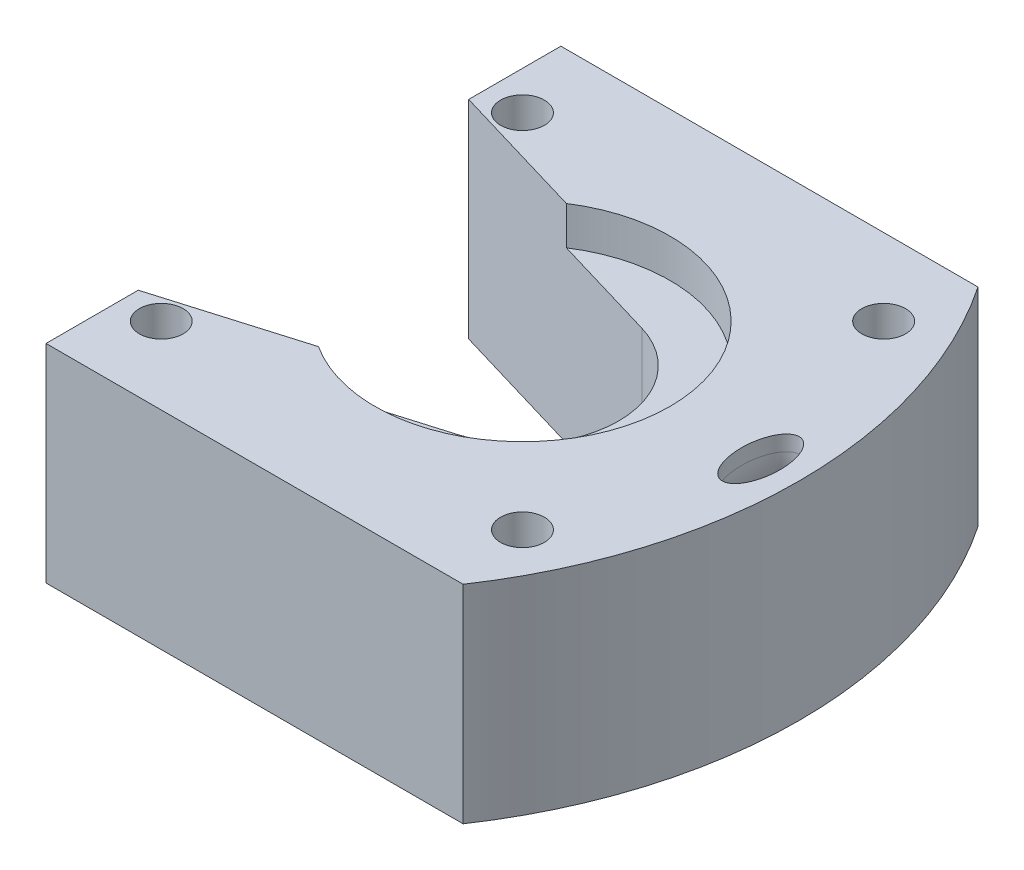
ISO-10303-21;
HEADER;
FILE_DESCRIPTION(('STEP AP214'),'2;1');
FILE_NAME('part.step','',(''),(''),'','','');
FILE_SCHEMA(('AUTOMOTIVE_DESIGN { 1 0 10303 214 1 1 1 1 }'));
ENDSEC;
DATA;
#1=APPLICATION_CONTEXT('core data for automotive mechanical design processes');
#2=APPLICATION_PROTOCOL_DEFINITION('international standard','automotive_design',2000,#1);
#3=PRODUCT_CONTEXT('',#1,'mechanical');
#4=PRODUCT('Part','Part','',(#3));
#5=PRODUCT_RELATED_PRODUCT_CATEGORY('part','',(#4));
#6=PRODUCT_DEFINITION_FORMATION('','',#4);
#7=PRODUCT_DEFINITION_CONTEXT('part definition',#1,'design');
#8=PRODUCT_DEFINITION('design','',#6,#7);
#9=PRODUCT_DEFINITION_SHAPE('','',#8);
#10=(LENGTH_UNIT() NAMED_UNIT(*) SI_UNIT(.MILLI.,.METRE.));
#11=(NAMED_UNIT(*) PLANE_ANGLE_UNIT() SI_UNIT($,.RADIAN.));
#12=(NAMED_UNIT(*) SI_UNIT($,.STERADIAN.) SOLID_ANGLE_UNIT());
#13=UNCERTAINTY_MEASURE_WITH_UNIT(LENGTH_MEASURE(1.E-05),#10,'distance_accuracy_value','');
#14=(GEOMETRIC_REPRESENTATION_CONTEXT(3) GLOBAL_UNCERTAINTY_ASSIGNED_CONTEXT((#13)) GLOBAL_UNIT_ASSIGNED_CONTEXT((#10,
#11,#12)) REPRESENTATION_CONTEXT('',''));
#15=CARTESIAN_POINT('',(0.,0.,0.));
#16=DIRECTION('',(0.,0.,1.));
#17=DIRECTION('',(1.,0.,0.));
#18=AXIS2_PLACEMENT_3D('',#15,#16,#17);
#19=CARTESIAN_POINT('',(184.75,-215.,-12.));
#20=DIRECTION('',(0.,1.,0.));
#21=DIRECTION('',(1.,0.,0.));
#22=AXIS2_PLACEMENT_3D('',#19,#20,#21);
#23=PLANE('',#22);
#24=CARTESIAN_POINT('',(204.5,-215.,11.5));
#25=DIRECTION('',(0.,1.,0.));
#26=DIRECTION('',(1.,0.,0.));
#27=AXIS2_PLACEMENT_3D('',#24,#25,#26);
#28=CIRCLE('',#27,2.85);
#29=CARTESIAN_POINT('',(201.65,-215.,11.5));
#30=VERTEX_POINT('',#29);
#31=EDGE_CURVE('E330',#30,#30,#28,.T.);
#32=ORIENTED_EDGE('',*,*,#31,.T.);
#33=EDGE_LOOP('',(#32));
#34=FACE_BOUND('',#33,.T.);
#35=CARTESIAN_POINT('',(204.5,-215.,-35.5));
#36=DIRECTION('',(0.,1.,0.));
#37=DIRECTION('',(1.,0.,0.));
#38=AXIS2_PLACEMENT_3D('',#35,#36,#37);
#39=CIRCLE('',#38,2.85);
#40=CARTESIAN_POINT('',(201.65,-215.,-35.5));
#41=VERTEX_POINT('',#40);
#42=EDGE_CURVE('E20',#41,#41,#39,.T.);
#43=ORIENTED_EDGE('',*,*,#42,.T.);
#44=EDGE_LOOP('',(#43));
#45=FACE_BOUND('',#44,.T.);
#46=CARTESIAN_POINT('',(157.5,-215.,11.5));
#47=DIRECTION('',(0.,1.,0.));
#48=DIRECTION('',(1.,0.,0.));
#49=AXIS2_PLACEMENT_3D('',#46,#47,#48);
#50=CIRCLE('',#49,2.85);
#51=CARTESIAN_POINT('',(154.65,-215.,11.5));
#52=VERTEX_POINT('',#51);
#53=EDGE_CURVE('E240',#52,#52,#50,.T.);
#54=ORIENTED_EDGE('',*,*,#53,.T.);
#55=EDGE_LOOP('',(#54));
#56=FACE_BOUND('',#55,.T.);
#57=CARTESIAN_POINT('',(157.5,-215.,-35.5));
#58=DIRECTION('',(0.,1.,0.));
#59=DIRECTION('',(1.,0.,0.));
#60=AXIS2_PLACEMENT_3D('',#57,#58,#59);
#61=CIRCLE('',#60,2.85);
#62=CARTESIAN_POINT('',(154.65,-215.,-35.5));
#63=VERTEX_POINT('',#62);
#64=EDGE_CURVE('E282',#63,#63,#61,.T.);
#65=ORIENTED_EDGE('',*,*,#64,.T.);
#66=EDGE_LOOP('',(#65));
#67=FACE_BOUND('',#66,.T.);
#68=CARTESIAN_POINT('',(197.,-215.,-12.));
#69=DIRECTION('',(0.,1.,0.));
#70=DIRECTION('',(0.,0.,-1.));
#71=AXIS2_PLACEMENT_3D('',#68,#69,#70);
#72=ELLIPSE('',#71,5.,2.5);
#73=CARTESIAN_POINT('',(197.,-215.,-7.));
#74=VERTEX_POINT('',#73);
#75=EDGE_CURVE('E221',#74,#74,#72,.T.);
#76=ORIENTED_EDGE('',*,*,#75,.T.);
#77=EDGE_LOOP('',(#76));
#78=FACE_BOUND('',#77,.T.);
#79=DIRECTION('',(0.,0.,-1.));
#80=VECTOR('',#79,1.);
#81=CARTESIAN_POINT('',(152.5,-215.,-22.75));
#82=LINE('',#81,#80);
#83=CARTESIAN_POINT('',(152.5,-215.,-33.5));
#84=VERTEX_POINT('',#83);
#85=CARTESIAN_POINT('',(152.5,-215.,-45.5));
#86=VERTEX_POINT('',#85);
#87=EDGE_CURVE('E351',#84,#86,#82,.T.);
#88=ORIENTED_EDGE('',*,*,#87,.T.);
#89=DIRECTION('',(1.,0.,0.));
#90=VECTOR('',#89,1.);
#91=CARTESIAN_POINT('',(168.625,-215.,-45.5));
#92=LINE('',#91,#90);
#93=CARTESIAN_POINT('',(206.777002722141,-215.,-45.5));
#94=VERTEX_POINT('',#93);
#95=EDGE_CURVE('E98',#86,#94,#92,.T.);
#96=ORIENTED_EDGE('',*,*,#95,.T.);
#97=CARTESIAN_POINT('',(157.,-215.,-12.));
#98=DIRECTION('',(0.,-1.,0.));
#99=DIRECTION('',(0.829616712035677,0.,-0.558333333333334));
#100=AXIS2_PLACEMENT_3D('',#97,#98,#99);
#101=CIRCLE('',#100,60.);
#102=CARTESIAN_POINT('',(206.777002722141,-215.,21.5));
#103=VERTEX_POINT('',#102);
#104=EDGE_CURVE('E212',#94,#103,#101,.T.);
#105=ORIENTED_EDGE('',*,*,#104,.T.);
#106=DIRECTION('',(-1.,0.,0.));
#107=VECTOR('',#106,1.);
#108=CARTESIAN_POINT('',(195.76350136107,-215.,21.5));
#109=LINE('',#108,#107);
#110=CARTESIAN_POINT('',(152.5,-215.,21.5));
#111=VERTEX_POINT('',#110);
#112=EDGE_CURVE('E206',#103,#111,#109,.T.);
#113=ORIENTED_EDGE('',*,*,#112,.T.);
#114=DIRECTION('',(0.,0.,-1.));
#115=VECTOR('',#114,1.);
#116=CARTESIAN_POINT('',(152.5,-215.,4.75));
#117=LINE('',#116,#115);
#118=CARTESIAN_POINT('',(152.5,-215.,9.5));
#119=VERTEX_POINT('',#118);
#120=EDGE_CURVE('E11',#111,#119,#117,.T.);
#121=ORIENTED_EDGE('',*,*,#120,.T.);
#122=DIRECTION('',(0.958648088356799,0.,-0.284594171918287));
#123=VECTOR('',#122,1.);
#124=CARTESIAN_POINT('',(170.251850119446,-215.,4.23000244185445));
#125=LINE('',#124,#123);
#126=CARTESIAN_POINT('',(184.557427148979,-215.,-0.0168988955400634));
#127=VERTEX_POINT('',#126);
#128=EDGE_CURVE('E175',#119,#127,#125,.T.);
#129=ORIENTED_EDGE('',*,*,#128,.T.);
#130=CARTESIAN_POINT('',(181.,-215.,-12.));
#131=DIRECTION('',(0.,1.,0.));
#132=DIRECTION('',(0.284594171918287,0.,-0.958648088356799));
#133=AXIS2_PLACEMENT_3D('',#130,#131,#132);
#134=CIRCLE('',#133,12.5);
#135=CARTESIAN_POINT('',(184.557427148979,-215.,-23.9831011044599));
#136=VERTEX_POINT('',#135);
#137=EDGE_CURVE('E27',#127,#136,#134,.T.);
#138=ORIENTED_EDGE('',*,*,#137,.T.);
#139=DIRECTION('',(-0.958648088356798,0.,-0.284594171918288));
#140=VECTOR('',#139,1.);
#141=CARTESIAN_POINT('',(186.280563693935,-215.,-23.4715529940844));
#142=LINE('',#141,#140);
#143=EDGE_CURVE('E248',#136,#84,#142,.T.);
#144=ORIENTED_EDGE('',*,*,#143,.T.);
#145=EDGE_LOOP('',(#88,#96,#105,#113,#121,#129,#138,#144));
#146=FACE_BOUND('',#145,.T.);
#147=ADVANCED_FACE('F16',(#34,#45,#56,#67,#78,#146),#23,.F.);
#148=CARTESIAN_POINT('',(152.5,-188.,21.5));
#149=DIRECTION('',(-1.,0.,0.));
#150=DIRECTION('',(0.,0.,1.));
#151=AXIS2_PLACEMENT_3D('',#148,#149,#150);
#152=PLANE('',#151);
#153=ORIENTED_EDGE('',*,*,#120,.F.);
#154=DIRECTION('',(0.,-1.,0.));
#155=VECTOR('',#154,1.);
#156=CARTESIAN_POINT('',(152.5,-188.,21.5));
#157=LINE('',#156,#155);
#158=CARTESIAN_POINT('',(152.5,-188.,21.5));
#159=VERTEX_POINT('',#158);
#160=EDGE_CURVE('E216',#159,#111,#157,.T.);
#161=ORIENTED_EDGE('',*,*,#160,.F.);
#162=DIRECTION('',(0.,0.,-1.));
#163=VECTOR('',#162,1.);
#164=CARTESIAN_POINT('',(152.5,-188.,21.5));
#165=LINE('',#164,#163);
#166=CARTESIAN_POINT('',(152.5,-188.,9.5));
#167=VERTEX_POINT('',#166);
#168=EDGE_CURVE('E263',#159,#167,#165,.T.);
#169=ORIENTED_EDGE('',*,*,#168,.T.);
#170=DIRECTION('',(0.,-1.,0.));
#171=VECTOR('',#170,1.);
#172=CARTESIAN_POINT('',(152.5,-188.,9.5));
#173=LINE('',#172,#171);
#174=EDGE_CURVE('E211',#167,#119,#173,.T.);
#175=ORIENTED_EDGE('',*,*,#174,.T.);
#176=EDGE_LOOP('',(#153,#161,#169,#175));
#177=FACE_BOUND('',#176,.T.);
#178=ADVANCED_FACE('F382',(#177),#152,.T.);
#179=CARTESIAN_POINT('',(181.,-188.,-12.));
#180=DIRECTION('',(0.,-1.,0.));
#181=DIRECTION('',(0.284594171918287,0.,-0.958648088356799));
#182=AXIS2_PLACEMENT_3D('',#179,#180,#181);
#183=CYLINDRICAL_SURFACE('',#182,12.5);
#184=CARTESIAN_POINT('',(181.,-193.,-12.));
#185=DIRECTION('',(0.,1.,0.));
#186=DIRECTION('',(0.284594171918287,0.,-0.958648088356799));
#187=AXIS2_PLACEMENT_3D('',#184,#185,#186);
#188=CIRCLE('',#187,12.5);
#189=CARTESIAN_POINT('',(184.557427148979,-193.,-0.0168988955400629));
#190=VERTEX_POINT('',#189);
#191=CARTESIAN_POINT('',(184.557427148979,-193.,-23.9831011044599));
#192=VERTEX_POINT('',#191);
#193=EDGE_CURVE('E169',#190,#192,#188,.T.);
#194=ORIENTED_EDGE('',*,*,#193,.T.);
#195=DIRECTION('',(0.,-1.,0.));
#196=VECTOR('',#195,1.);
#197=CARTESIAN_POINT('',(184.557427148979,-188.,-23.9831011044599));
#198=LINE('',#197,#196);
#199=EDGE_CURVE('E228',#192,#136,#198,.T.);
#200=ORIENTED_EDGE('',*,*,#199,.T.);
#201=ORIENTED_EDGE('',*,*,#137,.F.);
#202=DIRECTION('',(0.,-1.,0.));
#203=VECTOR('',#202,1.);
#204=CARTESIAN_POINT('',(184.557427148979,-188.,-0.0168988955400634));
#205=LINE('',#204,#203);
#206=EDGE_CURVE('E167',#190,#127,#205,.T.);
#207=ORIENTED_EDGE('',*,*,#206,.F.);
#208=EDGE_LOOP('',(#194,#200,#201,#207));
#209=FACE_BOUND('',#208,.T.);
#210=ADVANCED_FACE('F18',(#209),#183,.F.);
#211=CARTESIAN_POINT('',(184.557427148979,-188.,-23.9831011044599));
#212=DIRECTION('',(-0.284594171918288,0.,0.958648088356798));
#213=DIRECTION('',(0.,1.,0.));
#214=AXIS2_PLACEMENT_3D('',#211,#212,#213);
#215=PLANE('',#214);
#216=DIRECTION('',(0.,1.,0.));
#217=VECTOR('',#216,1.);
#218=CARTESIAN_POINT('',(170.586467348339,-188.,-28.1306645155362));
#219=LINE('',#218,#217);
#220=CARTESIAN_POINT('',(170.586467348339,-193.,-28.1306645155362));
#221=VERTEX_POINT('',#220);
#222=CARTESIAN_POINT('',(170.586467348339,-188.,-28.1306645155362));
#223=VERTEX_POINT('',#222);
#224=EDGE_CURVE('E276',#221,#223,#219,.T.);
#225=ORIENTED_EDGE('',*,*,#224,.T.);
#226=DIRECTION('',(-0.958648088356798,0.,-0.284594171918288));
#227=VECTOR('',#226,1.);
#228=CARTESIAN_POINT('',(184.557427148979,-188.,-23.9831011044599));
#229=LINE('',#228,#227);
#230=CARTESIAN_POINT('',(152.5,-188.,-33.5));
#231=VERTEX_POINT('',#230);
#232=EDGE_CURVE('E238',#223,#231,#229,.T.);
#233=ORIENTED_EDGE('',*,*,#232,.T.);
#234=DIRECTION('',(0.,-1.,0.));
#235=VECTOR('',#234,1.);
#236=CARTESIAN_POINT('',(152.5,-188.,-33.5));
#237=LINE('',#236,#235);
#238=EDGE_CURVE('E340',#231,#84,#237,.T.);
#239=ORIENTED_EDGE('',*,*,#238,.T.);
#240=ORIENTED_EDGE('',*,*,#143,.F.);
#241=ORIENTED_EDGE('',*,*,#199,.F.);
#242=DIRECTION('',(-0.958648088356798,0.,-0.284594171918288));
#243=VECTOR('',#242,1.);
#244=CARTESIAN_POINT('',(186.576131547511,-193.,-23.3838076686041));
#245=LINE('',#244,#243);
#246=EDGE_CURVE('E183',#192,#221,#245,.T.);
#247=ORIENTED_EDGE('',*,*,#246,.T.);
#248=EDGE_LOOP('',(#225,#233,#239,#240,#241,#247));
#249=FACE_BOUND('',#248,.T.);
#250=ADVANCED_FACE('F375',(#249),#215,.T.);
#251=CARTESIAN_POINT('',(157.5,-188.,-35.5));
#252=DIRECTION('',(0.,-1.,0.));
#253=DIRECTION('',(1.,0.,0.));
#254=AXIS2_PLACEMENT_3D('',#251,#252,#253);
#255=CYLINDRICAL_SURFACE('',#254,2.85);
#256=ORIENTED_EDGE('',*,*,#64,.F.);
#257=DIRECTION('',(0.,1.,0.));
#258=VECTOR('',#257,1.);
#259=CARTESIAN_POINT('',(154.65,-188.,-35.5));
#260=LINE('',#259,#258);
#261=CARTESIAN_POINT('',(154.65,-188.,-35.5));
#262=VERTEX_POINT('',#261);
#263=EDGE_CURVE('E204',#63,#262,#260,.T.);
#264=ORIENTED_EDGE('',*,*,#263,.T.);
#265=CARTESIAN_POINT('',(157.5,-188.,-35.5));
#266=DIRECTION('',(0.,1.,0.));
#267=DIRECTION('',(1.,0.,0.));
#268=AXIS2_PLACEMENT_3D('',#265,#266,#267);
#269=CIRCLE('',#268,2.85);
#270=EDGE_CURVE('E176',#262,#262,#269,.T.);
#271=ORIENTED_EDGE('',*,*,#270,.T.);
#272=ORIENTED_EDGE('',*,*,#263,.F.);
#273=EDGE_LOOP('',(#256,#264,#271,#272));
#274=FACE_BOUND('',#273,.T.);
#275=ADVANCED_FACE('F436',(#274),#255,.F.);
#276=CARTESIAN_POINT('',(157.5,-188.,11.5));
#277=DIRECTION('',(0.,-1.,0.));
#278=DIRECTION('',(1.,0.,0.));
#279=AXIS2_PLACEMENT_3D('',#276,#277,#278);
#280=CYLINDRICAL_SURFACE('',#279,2.85);
#281=ORIENTED_EDGE('',*,*,#53,.F.);
#282=DIRECTION('',(0.,1.,0.));
#283=VECTOR('',#282,1.);
#284=CARTESIAN_POINT('',(154.65,-188.,11.5));
#285=LINE('',#284,#283);
#286=CARTESIAN_POINT('',(154.65,-188.,11.5));
#287=VERTEX_POINT('',#286);
#288=EDGE_CURVE('E243',#52,#287,#285,.T.);
#289=ORIENTED_EDGE('',*,*,#288,.T.);
#290=CARTESIAN_POINT('',(157.5,-188.,11.5));
#291=DIRECTION('',(0.,1.,0.));
#292=DIRECTION('',(1.,0.,0.));
#293=AXIS2_PLACEMENT_3D('',#290,#291,#292);
#294=CIRCLE('',#293,2.85);
#295=EDGE_CURVE('E267',#287,#287,#294,.T.);
#296=ORIENTED_EDGE('',*,*,#295,.T.);
#297=ORIENTED_EDGE('',*,*,#288,.F.);
#298=EDGE_LOOP('',(#281,#289,#296,#297));
#299=FACE_BOUND('',#298,.T.);
#300=ADVANCED_FACE('F429',(#299),#280,.F.);
#301=CARTESIAN_POINT('',(204.5,-188.,-35.5));
#302=DIRECTION('',(0.,-1.,0.));
#303=DIRECTION('',(1.,0.,0.));
#304=AXIS2_PLACEMENT_3D('',#301,#302,#303);
#305=CYLINDRICAL_SURFACE('',#304,2.85);
#306=ORIENTED_EDGE('',*,*,#42,.F.);
#307=DIRECTION('',(0.,1.,0.));
#308=VECTOR('',#307,1.);
#309=CARTESIAN_POINT('',(201.65,-188.,-35.5));
#310=LINE('',#309,#308);
#311=CARTESIAN_POINT('',(201.65,-188.,-35.5));
#312=VERTEX_POINT('',#311);
#313=EDGE_CURVE('E244',#41,#312,#310,.T.);
#314=ORIENTED_EDGE('',*,*,#313,.T.);
#315=CARTESIAN_POINT('',(204.5,-188.,-35.5));
#316=DIRECTION('',(0.,1.,0.));
#317=DIRECTION('',(1.,0.,0.));
#318=AXIS2_PLACEMENT_3D('',#315,#316,#317);
#319=CIRCLE('',#318,2.85);
#320=EDGE_CURVE('E237',#312,#312,#319,.T.);
#321=ORIENTED_EDGE('',*,*,#320,.T.);
#322=ORIENTED_EDGE('',*,*,#313,.F.);
#323=EDGE_LOOP('',(#306,#314,#321,#322));
#324=FACE_BOUND('',#323,.T.);
#325=ADVANCED_FACE('F425',(#324),#305,.F.);
#326=CARTESIAN_POINT('',(204.5,-188.,11.5));
#327=DIRECTION('',(0.,-1.,0.));
#328=DIRECTION('',(1.,0.,0.));
#329=AXIS2_PLACEMENT_3D('',#326,#327,#328);
#330=CYLINDRICAL_SURFACE('',#329,2.85);
#331=ORIENTED_EDGE('',*,*,#31,.F.);
#332=DIRECTION('',(0.,1.,0.));
#333=VECTOR('',#332,1.);
#334=CARTESIAN_POINT('',(201.65,-188.,11.5));
#335=LINE('',#334,#333);
#336=CARTESIAN_POINT('',(201.65,-188.,11.5));
#337=VERTEX_POINT('',#336);
#338=EDGE_CURVE('E328',#30,#337,#335,.T.);
#339=ORIENTED_EDGE('',*,*,#338,.T.);
#340=CARTESIAN_POINT('',(204.5,-188.,11.5));
#341=DIRECTION('',(0.,1.,0.));
#342=DIRECTION('',(1.,0.,0.));
#343=AXIS2_PLACEMENT_3D('',#340,#341,#342);
#344=CIRCLE('',#343,2.85);
#345=EDGE_CURVE('E234',#337,#337,#344,.T.);
#346=ORIENTED_EDGE('',*,*,#345,.T.);
#347=ORIENTED_EDGE('',*,*,#338,.F.);
#348=EDGE_LOOP('',(#331,#339,#346,#347));
#349=FACE_BOUND('',#348,.T.);
#350=ADVANCED_FACE('F428',(#349),#330,.F.);
#351=CARTESIAN_POINT('',(152.5,-188.,-33.5));
#352=DIRECTION('',(-1.,0.,0.));
#353=DIRECTION('',(0.,0.,1.));
#354=AXIS2_PLACEMENT_3D('',#351,#352,#353);
#355=PLANE('',#354);
#356=ORIENTED_EDGE('',*,*,#87,.F.);
#357=ORIENTED_EDGE('',*,*,#238,.F.);
#358=DIRECTION('',(0.,0.,1.));
#359=VECTOR('',#358,1.);
#360=CARTESIAN_POINT('',(152.5,-188.,-45.5));
#361=LINE('',#360,#359);
#362=CARTESIAN_POINT('',(152.5,-188.,-45.5));
#363=VERTEX_POINT('',#362);
#364=EDGE_CURVE('E257',#363,#231,#361,.T.);
#365=ORIENTED_EDGE('',*,*,#364,.F.);
#366=DIRECTION('',(0.,-1.,0.));
#367=VECTOR('',#366,1.);
#368=CARTESIAN_POINT('',(152.5,-188.,-45.5));
#369=LINE('',#368,#367);
#370=EDGE_CURVE('E225',#363,#86,#369,.T.);
#371=ORIENTED_EDGE('',*,*,#370,.T.);
#372=EDGE_LOOP('',(#356,#357,#365,#371));
#373=FACE_BOUND('',#372,.T.);
#374=ADVANCED_FACE('F372',(#373),#355,.T.);
#375=CARTESIAN_POINT('',(152.5,-188.,-45.5));
#376=DIRECTION('',(0.,0.,-1.));
#377=DIRECTION('',(-1.,0.,0.));
#378=AXIS2_PLACEMENT_3D('',#375,#376,#377);
#379=PLANE('',#378);
#380=ORIENTED_EDGE('',*,*,#95,.F.);
#381=ORIENTED_EDGE('',*,*,#370,.F.);
#382=DIRECTION('',(1.,0.,0.));
#383=VECTOR('',#382,1.);
#384=CARTESIAN_POINT('',(152.5,-188.,-45.5));
#385=LINE('',#384,#383);
#386=CARTESIAN_POINT('',(206.777002722141,-188.,-45.5));
#387=VERTEX_POINT('',#386);
#388=EDGE_CURVE('E318',#363,#387,#385,.T.);
#389=ORIENTED_EDGE('',*,*,#388,.T.);
#390=DIRECTION('',(0.,-1.,0.));
#391=VECTOR('',#390,1.);
#392=CARTESIAN_POINT('',(206.777002722141,-188.,-45.5));
#393=LINE('',#392,#391);
#394=EDGE_CURVE('E215',#387,#94,#393,.T.);
#395=ORIENTED_EDGE('',*,*,#394,.T.);
#396=EDGE_LOOP('',(#380,#381,#389,#395));
#397=FACE_BOUND('',#396,.T.);
#398=ADVANCED_FACE('F440',(#397),#379,.T.);
#399=CARTESIAN_POINT('',(157.,-188.,-12.));
#400=DIRECTION('',(0.,-1.,0.));
#401=DIRECTION('',(0.829616712035677,0.,-0.558333333333334));
#402=AXIS2_PLACEMENT_3D('',#399,#400,#401);
#403=CYLINDRICAL_SURFACE('',#402,60.);
#404=ORIENTED_EDGE('',*,*,#104,.F.);
#405=ORIENTED_EDGE('',*,*,#394,.F.);
#406=CARTESIAN_POINT('',(157.,-188.,-12.));
#407=DIRECTION('',(0.,-1.,0.));
#408=DIRECTION('',(0.829616712035677,0.,-0.558333333333334));
#409=AXIS2_PLACEMENT_3D('',#406,#407,#408);
#410=CIRCLE('',#409,60.);
#411=CARTESIAN_POINT('',(206.777002722141,-188.,21.5));
#412=VERTEX_POINT('',#411);
#413=EDGE_CURVE('E262',#387,#412,#410,.T.);
#414=ORIENTED_EDGE('',*,*,#413,.T.);
#415=DIRECTION('',(0.,-1.,0.));
#416=VECTOR('',#415,1.);
#417=CARTESIAN_POINT('',(206.777002722141,-188.,21.5));
#418=LINE('',#417,#416);
#419=EDGE_CURVE('E210',#412,#103,#418,.T.);
#420=ORIENTED_EDGE('',*,*,#419,.T.);
#421=EDGE_LOOP('',(#404,#405,#414,#420));
#422=FACE_BOUND('',#421,.T.);
#423=ADVANCED_FACE('F312',(#422),#403,.T.);
#424=CARTESIAN_POINT('',(206.777002722141,-188.,21.5));
#425=DIRECTION('',(0.,0.,1.));
#426=DIRECTION('',(1.,0.,0.));
#427=AXIS2_PLACEMENT_3D('',#424,#425,#426);
#428=PLANE('',#427);
#429=ORIENTED_EDGE('',*,*,#112,.F.);
#430=ORIENTED_EDGE('',*,*,#419,.F.);
#431=DIRECTION('',(-1.,0.,0.));
#432=VECTOR('',#431,1.);
#433=CARTESIAN_POINT('',(206.777002722141,-188.,21.5));
#434=LINE('',#433,#432);
#435=EDGE_CURVE('E258',#412,#159,#434,.T.);
#436=ORIENTED_EDGE('',*,*,#435,.T.);
#437=ORIENTED_EDGE('',*,*,#160,.T.);
#438=EDGE_LOOP('',(#429,#430,#436,#437));
#439=FACE_BOUND('',#438,.T.);
#440=ADVANCED_FACE('F305',(#439),#428,.T.);
#441=CARTESIAN_POINT('',(152.5,-188.,9.5));
#442=DIRECTION('',(-0.284594171918287,0.,-0.958648088356799));
#443=DIRECTION('',(-0.958648088356799,0.,0.284594171918287));
#444=AXIS2_PLACEMENT_3D('',#441,#442,#443);
#445=PLANE('',#444);
#446=DIRECTION('',(0.,-1.,0.));
#447=VECTOR('',#446,1.);
#448=CARTESIAN_POINT('',(170.586467348339,-188.,4.13066451553621));
#449=LINE('',#448,#447);
#450=CARTESIAN_POINT('',(170.586467348339,-188.,4.13066451553619));
#451=VERTEX_POINT('',#450);
#452=CARTESIAN_POINT('',(170.586467348339,-193.,4.13066451553619));
#453=VERTEX_POINT('',#452);
#454=EDGE_CURVE('E190',#451,#453,#449,.T.);
#455=ORIENTED_EDGE('',*,*,#454,.T.);
#456=DIRECTION('',(0.958648088356799,0.,-0.284594171918287));
#457=VECTOR('',#456,1.);
#458=CARTESIAN_POINT('',(170.547417973021,-193.,4.14225711637413));
#459=LINE('',#458,#457);
#460=EDGE_CURVE('E181',#453,#190,#459,.T.);
#461=ORIENTED_EDGE('',*,*,#460,.T.);
#462=ORIENTED_EDGE('',*,*,#206,.T.);
#463=ORIENTED_EDGE('',*,*,#128,.F.);
#464=ORIENTED_EDGE('',*,*,#174,.F.);
#465=DIRECTION('',(0.958648088356799,0.,-0.284594171918287));
#466=VECTOR('',#465,1.);
#467=CARTESIAN_POINT('',(152.5,-188.,9.5));
#468=LINE('',#467,#466);
#469=EDGE_CURVE('E185',#167,#451,#468,.T.);
#470=ORIENTED_EDGE('',*,*,#469,.T.);
#471=EDGE_LOOP('',(#455,#461,#462,#463,#464,#470));
#472=FACE_BOUND('',#471,.T.);
#473=ADVANCED_FACE('F187',(#472),#445,.T.);
#474=CARTESIAN_POINT('',(184.75,-188.,-12.));
#475=DIRECTION('',(0.,-1.,0.));
#476=DIRECTION('',(0.,0.,-1.));
#477=AXIS2_PLACEMENT_3D('',#474,#475,#476);
#478=PLANE('',#477);
#479=ORIENTED_EDGE('',*,*,#270,.F.);
#480=EDGE_LOOP('',(#479));
#481=FACE_BOUND('',#480,.T.);
#482=ORIENTED_EDGE('',*,*,#295,.F.);
#483=EDGE_LOOP('',(#482));
#484=FACE_BOUND('',#483,.T.);
#485=ORIENTED_EDGE('',*,*,#320,.F.);
#486=EDGE_LOOP('',(#485));
#487=FACE_BOUND('',#486,.T.);
#488=ORIENTED_EDGE('',*,*,#345,.F.);
#489=EDGE_LOOP('',(#488));
#490=FACE_BOUND('',#489,.T.);
#491=CARTESIAN_POINT('',(212.,-188.,-12.));
#492=DIRECTION('',(0.,-1.,0.));
#493=DIRECTION('',(0.,0.,-1.));
#494=AXIS2_PLACEMENT_3D('',#491,#492,#493);
#495=ELLIPSE('',#494,5.,2.5);
#496=CARTESIAN_POINT('',(212.,-188.,-7.));
#497=VERTEX_POINT('',#496);
#498=EDGE_CURVE('E232',#497,#497,#495,.T.);
#499=ORIENTED_EDGE('',*,*,#498,.T.);
#500=EDGE_LOOP('',(#499));
#501=FACE_BOUND('',#500,.T.);
#502=CARTESIAN_POINT('',(181.,-188.,-12.));
#503=DIRECTION('',(0.,-1.,0.));
#504=DIRECTION('',(-1.,0.,0.));
#505=AXIS2_PLACEMENT_3D('',#502,#503,#504);
#506=CIRCLE('',#505,19.2);
#507=EDGE_CURVE('E281',#223,#451,#506,.T.);
#508=ORIENTED_EDGE('',*,*,#507,.T.);
#509=ORIENTED_EDGE('',*,*,#469,.F.);
#510=ORIENTED_EDGE('',*,*,#168,.F.);
#511=ORIENTED_EDGE('',*,*,#435,.F.);
#512=ORIENTED_EDGE('',*,*,#413,.F.);
#513=ORIENTED_EDGE('',*,*,#388,.F.);
#514=ORIENTED_EDGE('',*,*,#364,.T.);
#515=ORIENTED_EDGE('',*,*,#232,.F.);
#516=EDGE_LOOP('',(#508,#509,#510,#511,#512,#513,#514,#515));
#517=FACE_BOUND('',#516,.T.);
#518=ADVANCED_FACE('F320',(#481,#484,#487,#490,#501,#517),#478,.F.);
#519=CARTESIAN_POINT('',(185.393233674169,-193.,-12.));
#520=DIRECTION('',(0.,1.,0.));
#521=DIRECTION('',(1.,0.,0.));
#522=AXIS2_PLACEMENT_3D('',#519,#520,#521);
#523=PLANE('',#522);
#524=ORIENTED_EDGE('',*,*,#460,.F.);
#525=CARTESIAN_POINT('',(181.,-193.,-12.));
#526=DIRECTION('',(0.,-1.,0.));
#527=DIRECTION('',(-1.,0.,0.));
#528=AXIS2_PLACEMENT_3D('',#525,#526,#527);
#529=CIRCLE('',#528,19.2);
#530=EDGE_CURVE('E200',#221,#453,#529,.T.);
#531=ORIENTED_EDGE('',*,*,#530,.F.);
#532=ORIENTED_EDGE('',*,*,#246,.F.);
#533=ORIENTED_EDGE('',*,*,#193,.F.);
#534=EDGE_LOOP('',(#524,#531,#532,#533));
#535=FACE_BOUND('',#534,.T.);
#536=ADVANCED_FACE('F179',(#535),#523,.T.);
#537=CARTESIAN_POINT('',(181.,-188.,-12.));
#538=DIRECTION('',(0.,-1.,0.));
#539=DIRECTION('',(1.,0.,0.));
#540=AXIS2_PLACEMENT_3D('',#537,#538,#539);
#541=CYLINDRICAL_SURFACE('',#540,19.2);
#542=ORIENTED_EDGE('',*,*,#507,.F.);
#543=ORIENTED_EDGE('',*,*,#224,.F.);
#544=ORIENTED_EDGE('',*,*,#530,.T.);
#545=ORIENTED_EDGE('',*,*,#454,.F.);
#546=EDGE_LOOP('',(#542,#543,#544,#545));
#547=FACE_BOUND('',#546,.T.);
#548=ADVANCED_FACE('F379',(#547),#541,.F.);
#549=CARTESIAN_POINT('',(212.,-188.,-7.));
#550=CARTESIAN_POINT('',(209.5,-188.,-7.00000000000005));
#551=CARTESIAN_POINT('',(209.5,-188.,-12.));
#552=CARTESIAN_POINT('',(209.5,-188.,-17.));
#553=CARTESIAN_POINT('',(212.,-188.,-17.));
#554=CARTESIAN_POINT('',(214.5,-188.,-17.));
#555=CARTESIAN_POINT('',(214.5,-188.,-12.));
#556=CARTESIAN_POINT('',(214.5,-188.,-7.00000000000005));
#557=CARTESIAN_POINT('',(212.,-188.,-7.));
#558=CARTESIAN_POINT('',(212.,-190.,-7.));
#559=CARTESIAN_POINT('',(209.5,-190.,-7.00000000000005));
#560=CARTESIAN_POINT('',(209.5,-190.,-12.));
#561=CARTESIAN_POINT('',(209.5,-190.,-17.));
#562=CARTESIAN_POINT('',(212.,-190.,-17.));
#563=CARTESIAN_POINT('',(214.5,-190.,-17.));
#564=CARTESIAN_POINT('',(214.5,-190.,-12.));
#565=CARTESIAN_POINT('',(214.5,-190.,-7.00000000000005));
#566=CARTESIAN_POINT('',(212.,-190.,-7.));
#567=(BOUNDED_SURFACE() B_SPLINE_SURFACE(1,2,((#549,#550,#551,#552,#553,#554,#555,#556,#557),
(#558,#559,#560,#561,#562,#563,#564,#565,#566)),.UNSPECIFIED.,.F.,.T.,
.F.) B_SPLINE_SURFACE_WITH_KNOTS((2,2),(3,2,2,2,3),(0.,0.4),(-3.14159265358979,-1.5707963267949,
0.,1.5707963267949,3.14159265358979),
.UNSPECIFIED.) GEOMETRIC_REPRESENTATION_ITEM() RATIONAL_B_SPLINE_SURFACE(((1.,0.707106781186548,
1.,0.707106781186548,1.,0.707106781186548,1.,0.707106781186548,1.),(1.,0.707106781186548,1.,
0.707106781186548,1.,0.707106781186548,1.,0.707106781186548,1.))) REPRESENTATION_ITEM('') SURFACE());
#568=DIRECTION('',(0.,-1.,0.));
#569=VECTOR('',#568,1.);
#570=CARTESIAN_POINT('',(212.,-188.,-7.));
#571=LINE('',#570,#569);
#572=CARTESIAN_POINT('',(212.,-190.,-7.));
#573=VERTEX_POINT('',#572);
#574=EDGE_CURVE('E273',#497,#573,#571,.T.);
#575=CARTESIAN_POINT('',(212.,-190.,-12.));
#576=DIRECTION('',(0.,-1.,0.));
#577=DIRECTION('',(0.,0.,-1.));
#578=AXIS2_PLACEMENT_3D('',#575,#576,#577);
#579=ELLIPSE('',#578,5.,2.5);
#580=EDGE_CURVE('E233',#573,#573,#579,.T.);
#581=ORIENTED_EDGE('',*,*,#498,.F.);
#582=ORIENTED_EDGE('',*,*,#574,.T.);
#583=ORIENTED_EDGE('',*,*,#580,.T.);
#584=ORIENTED_EDGE('',*,*,#574,.F.);
#585=EDGE_LOOP('',(#581,#582,#583,#584));
#586=FACE_BOUND('',#585,.T.);
#587=ADVANCED_FACE('F401',(#586),#567,.T.);
#588=CARTESIAN_POINT('',(212.,-190.,-7.));
#589=CARTESIAN_POINT('',(212.,-198.195652173913,-7.00000000000004));
#590=CARTESIAN_POINT('',(204.5,-201.5,-7.));
#591=CARTESIAN_POINT('',(209.5,-190.,-7.00000000000005));
#592=CARTESIAN_POINT('',(209.5,-196.565217391304,-7.00000000000004));
#593=CARTESIAN_POINT('',(203.492042440318,-199.212201591512,-7.00000000000005));
#594=CARTESIAN_POINT('',(209.5,-190.,-12.));
#595=CARTESIAN_POINT('',(209.5,-196.565217391304,-12.));
#596=CARTESIAN_POINT('',(203.492042440318,-199.212201591512,-12.));
#597=CARTESIAN_POINT('',(209.5,-190.,-17.));
#598=CARTESIAN_POINT('',(209.5,-196.565217391304,-17.));
#599=CARTESIAN_POINT('',(203.492042440318,-199.212201591512,-17.));
#600=CARTESIAN_POINT('',(212.,-190.,-17.));
#601=CARTESIAN_POINT('',(212.,-198.195652173913,-17.));
#602=CARTESIAN_POINT('',(204.5,-201.5,-17.));
#603=CARTESIAN_POINT('',(214.5,-190.,-17.));
#604=CARTESIAN_POINT('',(214.5,-199.826086956522,-17.));
#605=CARTESIAN_POINT('',(205.507957559682,-203.787798408488,-17.));
#606=CARTESIAN_POINT('',(214.5,-190.,-12.));
#607=CARTESIAN_POINT('',(214.5,-199.826086956522,-12.));
#608=CARTESIAN_POINT('',(205.507957559682,-203.787798408488,-12.));
#609=CARTESIAN_POINT('',(214.5,-190.,-7.00000000000003));
#610=CARTESIAN_POINT('',(214.5,-199.826086956522,-7.00000000000003));
#611=CARTESIAN_POINT('',(205.507957559682,-203.787798408488,-7.00000000000003));
#612=CARTESIAN_POINT('',(212.,-190.,-7.));
#613=CARTESIAN_POINT('',(212.,-198.195652173913,-7.00000000000004));
#614=CARTESIAN_POINT('',(204.5,-201.5,-7.));
#615=(BOUNDED_SURFACE() B_SPLINE_SURFACE(2,2,((#588,#589,#590),(#591,#592,#593),(#594,#595,
#596),(#597,#598,#599),(#600,#601,#602),(#603,#604,#605),(#606,#607,#608),(#609,#610,#611),
(#612,#613,#614)),.UNSPECIFIED.,.T.,.F.,.F.) B_SPLINE_SURFACE_WITH_KNOTS((3,2,2,2,3),(3,3),
(-3.14159265358979,-1.5707963267949,0.,1.5707963267949,3.14159265358979),(0.,1.15580387392449),
.UNSPECIFIED.) GEOMETRIC_REPRESENTATION_ITEM() RATIONAL_B_SPLINE_SURFACE(((1.,0.837610596838615,
1.),(0.707106781186564,0.59228013301831,0.707106781186564),(1.,0.837610596838615,1.),
(0.707106781186564,0.59228013301831,0.707106781186564),(1.,0.837610596838615,1.),
(0.707106781186564,0.59228013301831,0.707106781186564),(1.,0.837610596838615,1.),
(0.707106781186564,0.59228013301831,0.707106781186564),(1.,0.837610596838615,1.))) REPRESENTATION_ITEM('') SURFACE());
#616=CARTESIAN_POINT('',(199.433333333333,-190.,-7.));
#617=DIRECTION('',(0.,0.,-1.));
#618=DIRECTION('',(1.,0.,0.));
#619=AXIS2_PLACEMENT_3D('',#616,#617,#618);
#620=CIRCLE('',#619,12.5666666666667);
#621=CARTESIAN_POINT('',(204.5,-201.5,-7.));
#622=VERTEX_POINT('',#621);
#623=EDGE_CURVE('E229',#573,#622,#620,.T.);
#624=CARTESIAN_POINT('',(204.5,-201.5,-12.));
#625=DIRECTION('',(-0.915119363395224,-0.403183023872682,0.));
#626=DIRECTION('',(0.,0.,-1.));
#627=AXIS2_PLACEMENT_3D('',#624,#625,#626);
#628=ELLIPSE('',#627,5.,2.5);
#629=EDGE_CURVE('E249',#622,#622,#628,.T.);
#630=ORIENTED_EDGE('',*,*,#580,.F.);
#631=ORIENTED_EDGE('',*,*,#623,.T.);
#632=ORIENTED_EDGE('',*,*,#629,.T.);
#633=ORIENTED_EDGE('',*,*,#623,.F.);
#634=EDGE_LOOP('',(#630,#631,#632,#633));
#635=FACE_BOUND('',#634,.T.);
#636=ADVANCED_FACE('F395',(#635),#615,.F.);
#637=CARTESIAN_POINT('',(204.5,-201.5,-7.));
#638=CARTESIAN_POINT('',(197.,-204.804347826087,-7.00000000000004));
#639=CARTESIAN_POINT('',(197.,-213.,-7.));
#640=CARTESIAN_POINT('',(203.492042440318,-199.212201591512,-7.00000000000004));
#641=CARTESIAN_POINT('',(194.5,-203.173913043478,-7.00000000000004));
#642=CARTESIAN_POINT('',(194.5,-213.,-7.00000000000004));
#643=CARTESIAN_POINT('',(203.492042440318,-199.212201591512,-12.));
#644=CARTESIAN_POINT('',(194.5,-203.173913043478,-12.));
#645=CARTESIAN_POINT('',(194.5,-213.,-12.));
#646=CARTESIAN_POINT('',(203.492042440318,-199.212201591512,-17.));
#647=CARTESIAN_POINT('',(194.5,-203.173913043478,-17.));
#648=CARTESIAN_POINT('',(194.5,-213.,-17.));
#649=CARTESIAN_POINT('',(204.5,-201.5,-17.));
#650=CARTESIAN_POINT('',(197.,-204.804347826087,-17.));
#651=CARTESIAN_POINT('',(197.,-213.,-17.));
#652=CARTESIAN_POINT('',(205.507957559682,-203.787798408488,-17.));
#653=CARTESIAN_POINT('',(199.5,-206.434782608696,-17.));
#654=CARTESIAN_POINT('',(199.5,-213.,-17.));
#655=CARTESIAN_POINT('',(205.507957559682,-203.787798408488,-12.));
#656=CARTESIAN_POINT('',(199.5,-206.434782608696,-12.));
#657=CARTESIAN_POINT('',(199.5,-213.,-12.));
#658=CARTESIAN_POINT('',(205.507957559682,-203.787798408488,-7.00000000000002));
#659=CARTESIAN_POINT('',(199.5,-206.434782608696,-7.00000000000003));
#660=CARTESIAN_POINT('',(199.5,-213.,-7.00000000000002));
#661=CARTESIAN_POINT('',(204.5,-201.5,-7.));
#662=CARTESIAN_POINT('',(197.,-204.804347826087,-7.00000000000004));
#663=CARTESIAN_POINT('',(197.,-213.,-7.));
#664=(BOUNDED_SURFACE() B_SPLINE_SURFACE(2,2,((#637,#638,#639),(#640,#641,#642),(#643,#644,
#645),(#646,#647,#648),(#649,#650,#651),(#652,#653,#654),(#655,#656,#657),(#658,#659,#660),
(#661,#662,#663)),.UNSPECIFIED.,.T.,.F.,.F.) B_SPLINE_SURFACE_WITH_KNOTS((3,2,2,2,3),(3,3),
(-3.14159265358979,-1.5707963267949,0.,1.5707963267949,3.14159265358979),(0.,1.15580387392449),
.UNSPECIFIED.) GEOMETRIC_REPRESENTATION_ITEM() RATIONAL_B_SPLINE_SURFACE(((1.,0.837610596838615,
1.),(0.707106781186556,0.592280133018303,0.707106781186556),(1.,0.837610596838615,1.),
(0.707106781186556,0.592280133018303,0.707106781186556),(1.,0.837610596838615,1.),
(0.707106781186556,0.592280133018303,0.707106781186556),(1.,0.837610596838615,1.),
(0.707106781186556,0.592280133018303,0.707106781186556),(1.,0.837610596838615,1.))) REPRESENTATION_ITEM('') SURFACE());
#665=CARTESIAN_POINT('',(209.566666666667,-213.,-7.));
#666=DIRECTION('',(0.,0.,1.));
#667=DIRECTION('',(-0.403183023872678,0.915119363395226,0.));
#668=AXIS2_PLACEMENT_3D('',#665,#666,#667);
#669=CIRCLE('',#668,12.5666666666666);
#670=CARTESIAN_POINT('',(197.,-213.,-7.));
#671=VERTEX_POINT('',#670);
#672=EDGE_CURVE('E253',#622,#671,#669,.T.);
#673=CARTESIAN_POINT('',(197.,-213.,-12.));
#674=DIRECTION('',(0.,-1.,0.));
#675=DIRECTION('',(0.,0.,-1.));
#676=AXIS2_PLACEMENT_3D('',#673,#674,#675);
#677=ELLIPSE('',#676,5.,2.5);
#678=EDGE_CURVE('E222',#671,#671,#677,.T.);
#679=ORIENTED_EDGE('',*,*,#629,.F.);
#680=ORIENTED_EDGE('',*,*,#672,.T.);
#681=ORIENTED_EDGE('',*,*,#678,.T.);
#682=ORIENTED_EDGE('',*,*,#672,.F.);
#683=EDGE_LOOP('',(#679,#680,#681,#682));
#684=FACE_BOUND('',#683,.T.);
#685=ADVANCED_FACE('F400',(#684),#664,.F.);
#686=CARTESIAN_POINT('',(197.,-213.,-7.));
#687=CARTESIAN_POINT('',(194.5,-213.,-7.00000000000005));
#688=CARTESIAN_POINT('',(194.5,-213.,-12.));
#689=CARTESIAN_POINT('',(194.5,-213.,-17.));
#690=CARTESIAN_POINT('',(197.,-213.,-17.));
#691=CARTESIAN_POINT('',(199.5,-213.,-17.));
#692=CARTESIAN_POINT('',(199.5,-213.,-12.));
#693=CARTESIAN_POINT('',(199.5,-213.,-7.00000000000005));
#694=CARTESIAN_POINT('',(197.,-213.,-7.));
#695=CARTESIAN_POINT('',(197.,-215.,-7.));
#696=CARTESIAN_POINT('',(194.5,-215.,-7.00000000000005));
#697=CARTESIAN_POINT('',(194.5,-215.,-12.));
#698=CARTESIAN_POINT('',(194.5,-215.,-17.));
#699=CARTESIAN_POINT('',(197.,-215.,-17.));
#700=CARTESIAN_POINT('',(199.5,-215.,-17.));
#701=CARTESIAN_POINT('',(199.5,-215.,-12.));
#702=CARTESIAN_POINT('',(199.5,-215.,-7.00000000000005));
#703=CARTESIAN_POINT('',(197.,-215.,-7.));
#704=(BOUNDED_SURFACE() B_SPLINE_SURFACE(1,2,((#686,#687,#688,#689,#690,#691,#692,#693,#694),
(#695,#696,#697,#698,#699,#700,#701,#702,#703)),.UNSPECIFIED.,.F.,.T.,
.F.) B_SPLINE_SURFACE_WITH_KNOTS((2,2),(3,2,2,2,3),(0.,0.400000000000013),(-3.14159265358979,
-1.5707963267949,0.,1.5707963267949,3.14159265358979),
.UNSPECIFIED.) GEOMETRIC_REPRESENTATION_ITEM() RATIONAL_B_SPLINE_SURFACE(((1.,0.707106781186548,
1.,0.707106781186548,1.,0.707106781186548,1.,0.707106781186548,1.),(1.,0.707106781186548,1.,
0.707106781186548,1.,0.707106781186548,1.,0.707106781186548,1.))) REPRESENTATION_ITEM('') SURFACE());
#705=DIRECTION('',(0.,-1.,0.));
#706=VECTOR('',#705,1.);
#707=CARTESIAN_POINT('',(197.,-213.,-7.));
#708=LINE('',#707,#706);
#709=EDGE_CURVE('E217',#671,#74,#708,.T.);
#710=ORIENTED_EDGE('',*,*,#678,.F.);
#711=ORIENTED_EDGE('',*,*,#709,.T.);
#712=ORIENTED_EDGE('',*,*,#75,.F.);
#713=ORIENTED_EDGE('',*,*,#709,.F.);
#714=EDGE_LOOP('',(#710,#711,#712,#713));
#715=FACE_BOUND('',#714,.T.);
#716=ADVANCED_FACE('F449',(#715),#704,.T.);
#717=CLOSED_SHELL('',(#147,#178,#210,#250,#275,#300,#325,#350,#374,#398,#423,#440,#473,#518,
#536,#548,#587,#636,#685,#716));
#718=MANIFOLD_SOLID_BREP('B1',#717);
#719=ADVANCED_BREP_SHAPE_REPRESENTATION('',(#18,#718),#14);
#720=SHAPE_DEFINITION_REPRESENTATION(#9,#719);
ENDSEC;
END-ISO-10303-21;
